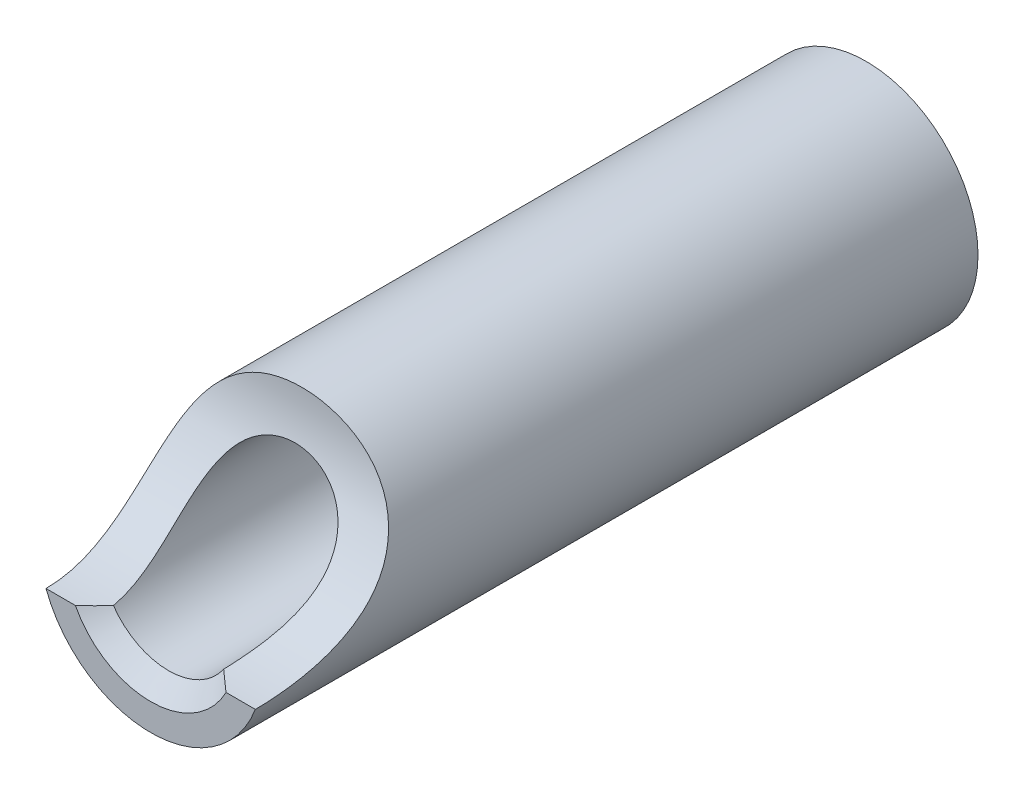
ISO-10303-21;
HEADER;
FILE_DESCRIPTION(('STEP AP214'),'2;1');
FILE_NAME('part.step','',(''),(''),'','','');
FILE_SCHEMA(('AUTOMOTIVE_DESIGN { 1 0 10303 214 1 1 1 1 }'));
ENDSEC;
DATA;
#1=APPLICATION_CONTEXT('core data for automotive mechanical design processes');
#2=APPLICATION_PROTOCOL_DEFINITION('international standard','automotive_design',2000,#1);
#3=PRODUCT_CONTEXT('',#1,'mechanical');
#4=PRODUCT('Part','Part','',(#3));
#5=PRODUCT_RELATED_PRODUCT_CATEGORY('part','',(#4));
#6=PRODUCT_DEFINITION_FORMATION('','',#4);
#7=PRODUCT_DEFINITION_CONTEXT('part definition',#1,'design');
#8=PRODUCT_DEFINITION('design','',#6,#7);
#9=PRODUCT_DEFINITION_SHAPE('','',#8);
#10=(LENGTH_UNIT() NAMED_UNIT(*) SI_UNIT(.MILLI.,.METRE.));
#11=(NAMED_UNIT(*) PLANE_ANGLE_UNIT() SI_UNIT($,.RADIAN.));
#12=(NAMED_UNIT(*) SI_UNIT($,.STERADIAN.) SOLID_ANGLE_UNIT());
#13=UNCERTAINTY_MEASURE_WITH_UNIT(LENGTH_MEASURE(1.E-05),#10,'distance_accuracy_value','');
#14=(GEOMETRIC_REPRESENTATION_CONTEXT(3) GLOBAL_UNCERTAINTY_ASSIGNED_CONTEXT((#13)) GLOBAL_UNIT_ASSIGNED_CONTEXT((#10,
#11,#12)) REPRESENTATION_CONTEXT('',''));
#15=CARTESIAN_POINT('',(0.,0.,0.));
#16=DIRECTION('',(0.,0.,1.));
#17=DIRECTION('',(1.,0.,0.));
#18=AXIS2_PLACEMENT_3D('',#15,#16,#17);
#19=CARTESIAN_POINT('',(0.,0.,50.8));
#20=DIRECTION('',(0.,0.,1.));
#21=DIRECTION('',(1.,0.,0.));
#22=AXIS2_PLACEMENT_3D('',#19,#20,#21);
#23=PLANE('',#22);
#24=DIRECTION('',(1.,0.,0.));
#25=VECTOR('',#24,1.);
#26=CARTESIAN_POINT('',(-7.9375,-2.78989828210711,50.8));
#27=LINE('',#26,#25);
#28=CARTESIAN_POINT('',(-7.43104123427503,-2.78989828210711,50.8));
#29=VERTEX_POINT('',#28);
#30=CARTESIAN_POINT('',(-5.34860017439103,-2.78989828210711,50.8));
#31=VERTEX_POINT('',#30);
#32=EDGE_CURVE('E94',#29,#31,#27,.T.);
#33=ORIENTED_EDGE('',*,*,#32,.F.);
#34=CARTESIAN_POINT('',(0.,0.,50.8));
#35=DIRECTION('',(0.,0.,1.));
#36=DIRECTION('',(1.,0.,0.));
#37=AXIS2_PLACEMENT_3D('',#34,#35,#36);
#38=CIRCLE('',#37,7.9375);
#39=CARTESIAN_POINT('',(7.43104123427503,-2.78989828210711,50.8));
#40=VERTEX_POINT('',#39);
#41=EDGE_CURVE('E95',#29,#40,#38,.T.);
#42=ORIENTED_EDGE('',*,*,#41,.T.);
#43=CARTESIAN_POINT('',(5.34860017439103,-2.78989828210711,50.8));
#44=VERTEX_POINT('',#43);
#45=EDGE_CURVE('E85',#44,#40,#27,.T.);
#46=ORIENTED_EDGE('',*,*,#45,.F.);
#47=CARTESIAN_POINT('',(0.,0.,50.8));
#48=DIRECTION('',(0.,0.,1.));
#49=DIRECTION('',(1.,0.,0.));
#50=AXIS2_PLACEMENT_3D('',#47,#48,#49);
#51=CIRCLE('',#50,6.0325);
#52=EDGE_CURVE('E86',#44,#31,#51,.F.);
#53=ORIENTED_EDGE('',*,*,#52,.T.);
#54=EDGE_LOOP('',(#33,#42,#46,#53));
#55=FACE_BOUND('',#54,.T.);
#56=ADVANCED_FACE('F43',(#55),#23,.T.);
#57=CARTESIAN_POINT('',(0.,0.,0.));
#58=DIRECTION('',(0.,0.,1.));
#59=DIRECTION('',(1.,0.,0.));
#60=AXIS2_PLACEMENT_3D('',#57,#58,#59);
#61=PLANE('',#60);
#62=CARTESIAN_POINT('',(0.,0.,0.));
#63=DIRECTION('',(0.,0.,1.));
#64=DIRECTION('',(1.,0.,0.));
#65=AXIS2_PLACEMENT_3D('',#62,#63,#64);
#66=CIRCLE('',#65,6.03249999999999);
#67=CARTESIAN_POINT('',(6.03249999999999,0.,0.));
#68=VERTEX_POINT('',#67);
#69=EDGE_CURVE('E160',#68,#68,#66,.T.);
#70=ORIENTED_EDGE('',*,*,#69,.T.);
#71=EDGE_LOOP('',(#70));
#72=FACE_BOUND('',#71,.T.);
#73=CARTESIAN_POINT('',(0.,0.,0.));
#74=DIRECTION('',(0.,0.,1.));
#75=DIRECTION('',(1.,0.,0.));
#76=AXIS2_PLACEMENT_3D('',#73,#74,#75);
#77=CIRCLE('',#76,7.9375);
#78=CARTESIAN_POINT('',(7.9375,0.,0.));
#79=VERTEX_POINT('',#78);
#80=EDGE_CURVE('E159',#79,#79,#77,.T.);
#81=ORIENTED_EDGE('',*,*,#80,.F.);
#82=EDGE_LOOP('',(#81));
#83=FACE_BOUND('',#82,.T.);
#84=ADVANCED_FACE('F135',(#72,#83),#61,.F.);
#85=CARTESIAN_POINT('',(0.,0.,50.8));
#86=DIRECTION('',(0.,0.,-1.));
#87=DIRECTION('',(-1.,0.,0.));
#88=AXIS2_PLACEMENT_3D('',#85,#86,#87);
#89=CYLINDRICAL_SURFACE('',#88,7.9375);
#90=ORIENTED_EDGE('',*,*,#41,.F.);
#91=CARTESIAN_POINT('',(-7.43104123427503,-2.78989828210711,50.8));
#92=CARTESIAN_POINT('',(-7.43102382136732,-2.78990287666445,50.6300305804789));
#93=CARTESIAN_POINT('',(-7.43255743304067,-2.78585876748104,50.4600656508634));
#94=CARTESIAN_POINT('',(-7.43859906079418,-2.76970866942878,50.1205840915058));
#95=CARTESIAN_POINT('',(-7.44310686184932,-2.7576032633671,49.9510674302446));
#96=CARTESIAN_POINT('',(-7.45496526672832,-2.72537693640078,49.613010811213));
#97=CARTESIAN_POINT('',(-7.46231395553059,-2.70526141478227,49.4444702729597));
#98=CARTESIAN_POINT('',(-7.47960163144594,-2.65708728652565,49.1086763089797));
#99=CARTESIAN_POINT('',(-7.48954064590534,-2.62902859603045,48.9414228968606));
#100=CARTESIAN_POINT('',(-7.52275189989414,-2.5331339163702,48.4425864015902));
#101=CARTESIAN_POINT('',(-7.54943806174162,-2.45353013550547,48.1134136834843));
#102=CARTESIAN_POINT('',(-7.60848021569662,-2.2637930983823,47.464583373558));
#103=CARTESIAN_POINT('',(-7.64083629896272,-2.15365935125944,47.1449259348169));
#104=CARTESIAN_POINT('',(-7.70233574094531,-1.92102106878398,46.5607278169839));
#105=CARTESIAN_POINT('',(-7.73130869441506,-1.80230290366631,46.2946545453673));
#106=CARTESIAN_POINT('',(-7.78710240029921,-1.54352167511713,45.7728642390489));
#107=CARTESIAN_POINT('',(-7.8139232976753,-1.40346005121877,45.5171465073774));
#108=CARTESIAN_POINT('',(-7.86197518912549,-1.10289819712657,45.0178652563709));
#109=CARTESIAN_POINT('',(-7.88321278062526,-0.942422424901867,44.7742876702836));
#110=CARTESIAN_POINT('',(-7.91650004182506,-0.601824881937868,44.3006127732499));
#111=CARTESIAN_POINT('',(-7.92855177653041,-0.421707537090205,44.0705124433235));
#112=CARTESIAN_POINT('',(-7.93844280788201,-0.084044057264312,43.6736857820491));
#113=CARTESIAN_POINT('',(-7.93879033193087,0.0699700601929678,43.5040087357604));
#114=CARTESIAN_POINT('',(-7.92959105876708,0.388393387492886,43.1750123071314));
#115=CARTESIAN_POINT('',(-7.92004652518047,0.5528002110625,43.0156905640233));
#116=CARTESIAN_POINT('',(-7.88918254279768,0.890772215138729,42.7084726447517));
#117=CARTESIAN_POINT('',(-7.86787031604665,1.06433171944766,42.5605695241686));
#118=CARTESIAN_POINT('',(-7.81166336377182,1.41918364925817,42.2770787619046));
#119=CARTESIAN_POINT('',(-7.7767684837153,1.60047616271895,42.1414912603627));
#120=CARTESIAN_POINT('',(-7.69137320831778,1.97054895184782,41.8823743048738));
#121=CARTESIAN_POINT('',(-7.64073281411452,2.1593825984532,41.7589666599726));
#122=CARTESIAN_POINT('',(-7.52258766260895,2.54054688233775,41.5263918064629));
#123=CARTESIAN_POINT('',(-7.45508285568243,2.73287752990545,41.4172246397589));
#124=CARTESIAN_POINT('',(-7.30232516710918,3.11815088145521,41.2136349154753));
#125=CARTESIAN_POINT('',(-7.2170826963214,3.31109316132285,41.11920376545));
#126=CARTESIAN_POINT('',(-7.0284235603619,3.69470276080392,40.9450465779261));
#127=CARTESIAN_POINT('',(-6.92500944724275,3.88537039586169,40.8653184787273));
#128=CARTESIAN_POINT('',(-6.71620937883633,4.23458896601063,40.7304706130676));
#129=CARTESIAN_POINT('',(-6.61320592477682,4.39384368274212,40.6734630445075));
#130=CARTESIAN_POINT('',(-6.3943568302916,4.7066473026656,40.5693681143987));
#131=CARTESIAN_POINT('',(-6.27851259412107,4.86019682732437,40.5222796697347));
#132=CARTESIAN_POINT('',(-6.03458466691356,5.15994592825254,40.4372517730344));
#133=CARTESIAN_POINT('',(-5.90649959355786,5.30614467156994,40.3993133559901));
#134=CARTESIAN_POINT('',(-5.63889137830772,5.58970647953128,40.3316576211885));
#135=CARTESIAN_POINT('',(-5.49936783446307,5.72706923337377,40.3019405924931));
#136=CARTESIAN_POINT('',(-5.21155080996345,5.9900913555497,40.2500032139038));
#137=CARTESIAN_POINT('',(-5.06338337455723,6.1158718791936,40.2276967834758));
#138=CARTESIAN_POINT('',(-4.7576708045974,6.35659859858504,40.1890294262914));
#139=CARTESIAN_POINT('',(-4.60012174634901,6.47154020848765,40.1726710077992));
#140=CARTESIAN_POINT('',(-4.27669673071728,6.68968005124859,40.1448550946417));
#141=CARTESIAN_POINT('',(-4.11082101241473,6.79287862100354,40.1333974593516));
#142=CARTESIAN_POINT('',(-3.77173904915526,6.98684822231555,40.1143631729308));
#143=CARTESIAN_POINT('',(-3.59853233984044,7.07761846509363,40.1067867680437));
#144=CARTESIAN_POINT('',(-3.23118121890754,7.25314911320936,40.0940615628894));
#145=CARTESIAN_POINT('',(-3.03649126155879,7.33678791981515,40.0891660044906));
#146=CARTESIAN_POINT('',(-2.64100671426011,7.48824637138037,40.0817447095968));
#147=CARTESIAN_POINT('',(-2.44021184398751,7.5560652886854,40.0792190820934));
#148=CARTESIAN_POINT('',(-2.03379159582999,7.67544541188357,40.0756365459336));
#149=CARTESIAN_POINT('',(-1.82816530449564,7.72700351642451,40.0745799173221));
#150=CARTESIAN_POINT('',(-1.41344593813608,7.81351068200985,40.073231036787));
#151=CARTESIAN_POINT('',(-1.20435280924588,7.84845948474122,40.0729387967512));
#152=CARTESIAN_POINT('',(-0.773924495256755,7.90279910859216,40.0726214288197));
#153=CARTESIAN_POINT('',(-0.55248417020049,7.92136086992471,40.0726098230092));
#154=CARTESIAN_POINT('',(-0.108821911205786,7.93985911048411,40.0725980380658));
#155=CARTESIAN_POINT('',(0.113400050017452,7.93979493294639,40.0725978593359));
#156=CARTESIAN_POINT('',(0.557081925983102,7.92103981558556,40.0726102526628));
#157=CARTESIAN_POINT('',(0.778541754002242,7.90234682201283,40.0726228261255));
#158=CARTESIAN_POINT('',(1.21911362131316,7.84646259335156,40.0729517201595));
#159=CARTESIAN_POINT('',(1.43822566935034,7.8092714271926,40.073268039599));
#160=CARTESIAN_POINT('',(1.87366608047325,7.71641694102895,40.0747792047649));
#161=CARTESIAN_POINT('',(2.08997458429771,7.66066051250474,40.0759785163561));
#162=CARTESIAN_POINT('',(2.51711441224049,7.53112529358036,40.0801059368539));
#163=CARTESIAN_POINT('',(2.72794567078238,7.45734628751446,40.0830340664489));
#164=CARTESIAN_POINT('',(3.14263237186589,7.29229568937398,40.0917036258467));
#165=CARTESIAN_POINT('',(3.34648664098042,7.20102117168457,40.097445526421));
#166=CARTESIAN_POINT('',(3.74566174434047,7.00169181846985,40.1130301270691));
#167=CARTESIAN_POINT('',(3.9409826969583,6.89363721580899,40.1228727702384));
#168=CARTESIAN_POINT('',(4.31977867449776,6.66274324086284,40.1479851845992));
#169=CARTESIAN_POINT('',(4.50334850550061,6.54005386370649,40.163202580503));
#170=CARTESIAN_POINT('',(4.85919245243613,6.28018216418937,40.2005851233279));
#171=CARTESIAN_POINT('',(5.03146656754056,6.14299984076593,40.2227502707584));
#172=CARTESIAN_POINT('',(5.36319971911526,5.85560582055087,40.2755468935885));
#173=CARTESIAN_POINT('',(5.5226673083275,5.70540296119538,40.3061726569089));
#174=CARTESIAN_POINT('',(5.82759466033357,5.39356898422031,40.3773780353624));
#175=CARTESIAN_POINT('',(5.97305561285844,5.23193883926645,40.4179568040415));
#176=CARTESIAN_POINT('',(6.23961577527605,4.91037300546002,40.5073070286199));
#177=CARTESIAN_POINT('',(6.3616932561422,4.75104531198242,40.5553501732749));
#178=CARTESIAN_POINT('',(6.59193554411299,4.42605259019641,40.6621474508343));
#179=CARTESIAN_POINT('',(6.70010107495998,4.26038789214064,40.7209010261645));
#180=CARTESIAN_POINT('',(6.90201911734241,3.92483973314183,40.8497281288322));
#181=CARTESIAN_POINT('',(6.99577772128369,3.75495809095937,40.9197968453671));
#182=CARTESIAN_POINT('',(7.16879845948029,3.41305464766019,41.0716165547509));
#183=CARTESIAN_POINT('',(7.24806105230723,3.24103291442775,41.1533671779047));
#184=CARTESIAN_POINT('',(7.38750399675042,2.90843964275421,41.3227583474116));
#185=CARTESIAN_POINT('',(7.44860289189289,2.7478675146072,41.4096455086561));
#186=CARTESIAN_POINT('',(7.5587995738205,2.42837593338201,41.5934487311609));
#187=CARTESIAN_POINT('',(7.60789800040874,2.26945639262911,41.6903642573683));
#188=CARTESIAN_POINT('',(7.6947777365213,1.95472877078506,41.8938979209602));
#189=CARTESIAN_POINT('',(7.73255628093448,1.79892145857967,42.0005184207027));
#190=CARTESIAN_POINT('',(7.7976405784127,1.4917639580717,42.2229651827356));
#191=CARTESIAN_POINT('',(7.82494575352329,1.34041401616661,42.3387919526322));
#192=CARTESIAN_POINT('',(7.87157701811081,1.03338007397375,42.587099485936));
#193=CARTESIAN_POINT('',(7.89025029577197,0.878079143633538,42.7201756793556));
#194=CARTESIAN_POINT('',(7.91811686012925,0.574901539588192,42.9954403401729));
#195=CARTESIAN_POINT('',(7.92730982006122,0.427025121955592,43.1376291214806));
#196=CARTESIAN_POINT('',(7.9375772820049,0.139527823145272,43.4304134417616));
#197=CARTESIAN_POINT('',(7.93865073360163,-9.19875630392625E-05,43.5810100659128));
#198=CARTESIAN_POINT('',(7.93404387610593,-0.270446054395075,43.8899454879953));
#199=CARTESIAN_POINT('',(7.92836121887344,-0.401177204494225,44.0482869593661));
#200=CARTESIAN_POINT('',(7.90989390693172,-0.678613783852588,44.4046577045487));
#201=CARTESIAN_POINT('',(7.89590881020568,-0.823229149697682,44.604254457878));
#202=CARTESIAN_POINT('',(7.86238293051072,-1.09819386979365,45.0126064154519));
#203=CARTESIAN_POINT('',(7.84284134346322,-1.22854115552983,45.2213629415051));
#204=CARTESIAN_POINT('',(7.8003209128347,-1.47462359322823,45.6473701113936));
#205=CARTESIAN_POINT('',(7.77733726839133,-1.59033791313799,45.8646323009673));
#206=CARTESIAN_POINT('',(7.72999114882314,-1.806482712425,46.3064109493798));
#207=CARTESIAN_POINT('',(7.70562897561742,-1.90691652083172,46.5309258151837));
#208=CARTESIAN_POINT('',(7.65259776899222,-2.11065345708935,47.0318880602186));
#209=CARTESIAN_POINT('',(7.62404034515744,-2.21052342782973,47.3097518270733));
#210=CARTESIAN_POINT('',(7.57060495110342,-2.3871258983928,47.8731674362436));
#211=CARTESIAN_POINT('',(7.54572795089281,-2.4638523040371,48.1587212819916));
#212=CARTESIAN_POINT('',(7.50218788803438,-2.59340524256803,48.7350179942113));
#213=CARTESIAN_POINT('',(7.48351150518844,-2.64628309585342,49.0257483052244));
#214=CARTESIAN_POINT('',(7.45416238914075,-2.72787019902771,49.6108448758105));
#215=CARTESIAN_POINT('',(7.44348413111675,-2.75659613389263,49.905208482496));
#216=CARTESIAN_POINT('',(7.43523171009228,-2.77871385296336,50.3001386623243));
#217=CARTESIAN_POINT('',(7.43366173602437,-2.78290939706428,50.4001067663649));
#218=CARTESIAN_POINT('',(7.43156687133923,-2.78850006953762,50.6000460665885));
#219=CARTESIAN_POINT('',(7.43104108242416,-2.78989760500609,50.7000171860604));
#220=CARTESIAN_POINT('',(7.43104123427503,-2.78989828210711,50.8));
#221=B_SPLINE_CURVE_WITH_KNOTS('',3,(#91,#92,#93,#94,#95,#96,#97,#98,#99,#100,#101,#102,#103,
#104,#105,#106,#107,#108,#109,#110,#111,#112,#113,#114,#115,#116,#117,#118,#119,#120,#121,#122,
#123,#124,#125,#126,#127,#128,#129,#130,#131,#132,#133,#134,#135,#136,#137,#138,#139,#140,#141,
#142,#143,#144,#145,#146,#147,#148,#149,#150,#151,#152,#153,#154,#155,#156,#157,#158,#159,#160,
#161,#162,#163,#164,#165,#166,#167,#168,#169,#170,#171,#172,#173,#174,#175,#176,#177,#178,#179,
#180,#181,#182,#183,#184,#185,#186,#187,#188,#189,#190,#191,#192,#193,#194,#195,#196,#197,#198,
#199,#200,#201,#202,#203,#204,#205,#206,#207,#208,#209,#210,#211,#212,#213,#214,#215,#216,#217,
#218,#219,#220),.UNSPECIFIED.,.F.,.F.,(4,2,2,2,2,2,2,2,2,2,2,2,2,2,2,2,2,2,2,2,2,2,2,2,2,2,2,2,
2,2,2,2,2,2,2,2,2,2,2,2,2,2,2,2,2,2,2,2,2,2,2,2,2,2,2,2,2,2,2,2,2,2,2,2,4),(0.,
0.509845414138052,1.01965397201026,1.52911946923528,2.03859034515617,3.0559905843102,
4.07340718229475,4.95085338894839,5.82824044144487,6.704586035469,7.58073456649302,
8.26757405911852,8.95425641511876,9.64051780945825,10.326787011767,11.019341532883,
11.7118980918923,12.4040493058887,13.096103390715,13.6895054213489,14.2828426220308,
14.8762469057443,15.4696720507527,16.0559411240219,16.6424571397929,17.228956324734,
17.8154927153267,18.4506410759057,19.0858186451223,19.7211172857626,20.3564258064415,
21.0222880656987,21.6881738037617,22.3541329610849,23.0200896368693,23.6894378286186,
24.3587940304621,25.0282622604399,25.6977212007498,26.3608287151634,27.0239362781984,
27.6865972419552,28.3492018691991,28.9675460875384,29.5858581246908,30.2039079659695,
30.8219382522709,31.3988627585566,31.9757564994896,32.5527910437724,33.1298574261124,
33.7453708834771,34.3609055554281,34.9765198572967,35.5923481834397,36.3322810443941,
37.0723210354248,37.8134029908712,38.5543232614619,39.4432222363125,40.3323550726886,
41.2195653204806,42.1061621481226,42.4063344655777,42.7062484369379),.UNSPECIFIED.);
#222=EDGE_CURVE('E72',#29,#40,#221,.T.);
#223=ORIENTED_EDGE('',*,*,#222,.T.);
#224=EDGE_LOOP('',(#90,#223));
#225=FACE_BOUND('',#224,.T.);
#226=ORIENTED_EDGE('',*,*,#80,.T.);
#227=EDGE_LOOP('',(#226));
#228=FACE_BOUND('',#227,.T.);
#229=ADVANCED_FACE('F126',(#225,#228),#89,.T.);
#230=CARTESIAN_POINT('',(0.,0.,50.8));
#231=DIRECTION('',(0.,0.,-1.));
#232=DIRECTION('',(-1.,0.,0.));
#233=AXIS2_PLACEMENT_3D('',#230,#231,#232);
#234=CYLINDRICAL_SURFACE('',#233,4.7625);
#235=CARTESIAN_POINT('',(-3.91319984407248,-2.71445634158133,49.53));
#236=CARTESIAN_POINT('',(-3.92477474195459,-2.69775519508808,49.3899162085328));
#237=CARTESIAN_POINT('',(-3.93811611844276,-2.67830965194911,49.2503326703605));
#238=CARTESIAN_POINT('',(-3.96789072660615,-2.63400441673134,48.972387630169));
#239=CARTESIAN_POINT('',(-3.98432332276705,-2.60914583733676,48.8340258830759));
#240=CARTESIAN_POINT('',(-4.03756313443191,-2.52661522842537,48.4213432830804));
#241=CARTESIAN_POINT('',(-4.07834166340507,-2.46094870362557,48.1490947210658));
#242=CARTESIAN_POINT('',(-4.16675323114825,-2.30812202232267,47.6087610603299));
#243=CARTESIAN_POINT('',(-4.21445364003718,-2.22074377921141,47.3407495182108));
#244=CARTESIAN_POINT('',(-4.31178303705702,-2.02530298558978,46.8126557766273));
#245=CARTESIAN_POINT('',(-4.36141255450945,-1.91723472562796,46.5525757889109));
#246=CARTESIAN_POINT('',(-4.45953684002279,-1.67671799519169,46.0325327264907));
#247=CARTESIAN_POINT('',(-4.50793483451605,-1.5435624358726,45.772877519965));
#248=CARTESIAN_POINT('',(-4.59641924167773,-1.25578782333059,45.2641239475283));
#249=CARTESIAN_POINT('',(-4.63650408449052,-1.10116472536433,45.0150275826022));
#250=CARTESIAN_POINT('',(-4.7024895504514,-0.772020724570098,44.530503870173));
#251=CARTESIAN_POINT('',(-4.7284744536202,-0.597625756111042,44.2950029950161));
#252=CARTESIAN_POINT('',(-4.76055398171783,-0.229395675322941,43.8383427760397));
#253=CARTESIAN_POINT('',(-4.76666791149317,-0.0355796196375981,43.617169717516));
#254=CARTESIAN_POINT('',(-4.75568641732243,0.277890105398365,43.2877745253676));
#255=CARTESIAN_POINT('',(-4.74780461695139,0.391626668609118,43.1735484637219));
#256=CARTESIAN_POINT('',(-4.7229374401565,0.623592466895284,42.95081880947));
#257=CARTESIAN_POINT('',(-4.70595520818974,0.741820137063701,42.842313254482));
#258=CARTESIAN_POINT('',(-4.66176323997821,0.981976856696082,42.6315666575633));
#259=CARTESIAN_POINT('',(-4.63455069667544,1.10390691359609,42.5293273439667));
#260=CARTESIAN_POINT('',(-4.56883652988234,1.3503319825667,42.3317519320097));
#261=CARTESIAN_POINT('',(-4.5303345628083,1.4748270725946,42.2364160438592));
#262=CARTESIAN_POINT('',(-4.44064152800393,1.72630004516187,42.0522800095183));
#263=CARTESIAN_POINT('',(-4.38932133317566,1.85329026991172,41.9635590974261));
#264=CARTESIAN_POINT('',(-4.27346248017366,2.10673518511485,41.7943088213265));
#265=CARTESIAN_POINT('',(-4.20892365357021,2.2331898687234,41.7137795617154));
#266=CARTESIAN_POINT('',(-4.06626123484679,2.48347633544905,41.5613771232087));
#267=CARTESIAN_POINT('',(-3.98814900167767,2.60731021535468,41.4894967908847));
#268=CARTESIAN_POINT('',(-3.81826028399642,2.85030822784817,41.3545319701076));
#269=CARTESIAN_POINT('',(-3.72648632218529,2.96947321744722,41.2914458619166));
#270=CARTESIAN_POINT('',(-3.54380919040815,3.18429808588268,41.1824894568519));
#271=CARTESIAN_POINT('',(-3.4546766377466,3.28087465679276,41.1354479796949));
#272=CARTESIAN_POINT('',(-3.26713795633864,3.46766841297736,41.0476501170323));
#273=CARTESIAN_POINT('',(-3.16873272178008,3.55788620998068,41.0068931264952));
#274=CARTESIAN_POINT('',(-2.96332225570445,3.73070259394992,40.93142234796));
#275=CARTESIAN_POINT('',(-2.85631836304389,3.8133023627981,40.8967076218042));
#276=CARTESIAN_POINT('',(-2.63451794640045,3.96977810852889,40.8329845306473));
#277=CARTESIAN_POINT('',(-2.51972175212318,4.04365445415255,40.8039759244127));
#278=CARTESIAN_POINT('',(-2.29371336655106,4.17562846786185,40.7536107076613));
#279=CARTESIAN_POINT('',(-2.18307653917938,4.23454285651943,40.731805092822));
#280=CARTESIAN_POINT('',(-1.95685809936797,4.34371840023418,40.6923207172322));
#281=CARTESIAN_POINT('',(-1.84127492879149,4.39397680316244,40.6746432683789));
#282=CARTESIAN_POINT('',(-1.60608546971214,4.48528731532908,40.6431483919929));
#283=CARTESIAN_POINT('',(-1.48648113829372,4.52634383058556,40.6293291163201));
#284=CARTESIAN_POINT('',(-1.24400728188263,4.59889906972001,40.6052817464593));
#285=CARTESIAN_POINT('',(-1.1211365590192,4.63039423311215,40.5950549898423));
#286=CARTESIAN_POINT('',(-0.873366670874833,4.6834439643601,40.5780154461313));
#287=CARTESIAN_POINT('',(-0.748473502941439,4.70502377111882,40.5711939871962));
#288=CARTESIAN_POINT('',(-0.497186197713734,4.738172558113,40.5607773545571));
#289=CARTESIAN_POINT('',(-0.370791526925702,4.74973786531246,40.5571833645798));
#290=CARTESIAN_POINT('',(-0.11747121836675,4.7627394404709,40.553146051617));
#291=CARTESIAN_POINT('',(0.00945424492675905,4.76417880960195,40.5527017640025));
#292=CARTESIAN_POINT('',(0.263034210030704,4.75692275713666,40.5549516082186));
#293=CARTESIAN_POINT('',(0.389688594166705,4.74822358428764,40.5576469016915));
#294=CARTESIAN_POINT('',(0.64270578135575,4.72066165579764,40.5662697495959));
#295=CARTESIAN_POINT('',(0.76905983539328,4.70172577629517,40.5722205628881));
#296=CARTESIAN_POINT('',(1.01968978402765,4.65380733524417,40.5875043141291));
#297=CARTESIAN_POINT('',(1.14396488858501,4.62482104135771,40.5968385085944));
#298=CARTESIAN_POINT('',(1.38944469596862,4.55708839408115,40.6190786232835));
#299=CARTESIAN_POINT('',(1.51065063821459,4.51834605195284,40.6319830757875));
#300=CARTESIAN_POINT('',(1.74921213992428,4.43145392734487,40.6616164483462));
#301=CARTESIAN_POINT('',(1.86656627797814,4.38330071661459,40.6783467624888));
#302=CARTESIAN_POINT('',(2.09607498661402,4.27828686634574,40.715837812748));
#303=CARTESIAN_POINT('',(2.20824814603751,4.22146112077661,40.7365824829488));
#304=CARTESIAN_POINT('',(2.42708311212328,4.09955619245618,40.7824404196852));
#305=CARTESIAN_POINT('',(2.53374488012158,4.03447695181531,40.8075537168624));
#306=CARTESIAN_POINT('',(2.74078936855524,3.89678483057353,40.8624357777758));
#307=CARTESIAN_POINT('',(2.84117349912627,3.82417365167373,40.892203490701));
#308=CARTESIAN_POINT('',(3.03502610801124,3.67221902595228,40.9566640113774));
#309=CARTESIAN_POINT('',(3.12849448142468,3.59287547705096,40.9913568938119));
#310=CARTESIAN_POINT('',(3.30725124884191,3.42900482162599,41.0655991296977));
#311=CARTESIAN_POINT('',(3.3925980666363,3.34452326732398,41.1051082455574));
#312=CARTESIAN_POINT('',(3.55552291042352,3.17078485337193,41.1893365031945));
#313=CARTESIAN_POINT('',(3.63309831507107,3.0815263979153,41.2340573920046));
#314=CARTESIAN_POINT('',(3.8536102940412,2.80815396426213,41.3761558303912));
#315=CARTESIAN_POINT('',(3.98450983888547,2.61827787413094,41.4815416990904));
#316=CARTESIAN_POINT('',(4.21677141561063,2.22575636957439,41.7166610734099));
#317=CARTESIAN_POINT('',(4.31709677854445,2.02289770693877,41.8470458118535));
#318=CARTESIAN_POINT('',(4.48469517504473,1.61771810108968,42.1283084033941));
#319=CARTESIAN_POINT('',(4.55195275573634,1.41539745313494,42.2791957956097));
#320=CARTESIAN_POINT('',(4.64201541831934,1.07457990184289,42.5531372253435));
#321=CARTESIAN_POINT('',(4.67203120250179,0.934367085624284,42.6718223982537));
#322=CARTESIAN_POINT('',(4.71875416701341,0.658986341459365,42.9174666007618));
#323=CARTESIAN_POINT('',(4.73545665049312,0.523820209967337,43.0444285332755));
#324=CARTESIAN_POINT('',(4.75727002069524,0.259611617737427,43.3058873428067));
#325=CARTESIAN_POINT('',(4.7623616443306,0.130579680656124,43.4403963627131));
#326=CARTESIAN_POINT('',(4.76263282626502,-0.120316179798814,43.7159741959945));
#327=CARTESIAN_POINT('',(4.75780937183347,-0.242177912908211,43.8570449904574));
#328=CARTESIAN_POINT('',(4.73601834101968,-0.5295218837044,44.2077332116234));
#329=CARTESIAN_POINT('',(4.71467791256945,-0.690897144110019,44.4204546637501));
#330=CARTESIAN_POINT('',(4.6596304006388,-0.996695421558549,44.856248778224));
#331=CARTESIAN_POINT('',(4.62591761128367,-1.14111057632705,45.0793261749878));
#332=CARTESIAN_POINT('',(4.55034114239115,-1.41269057443243,45.534883732701));
#333=CARTESIAN_POINT('',(4.50846420074745,-1.53982677119858,45.7673786983629));
#334=CARTESIAN_POINT('',(4.42064723123003,-1.7762845120362,46.2404607877242));
#335=CARTESIAN_POINT('',(4.37470765133628,-1.88560801651246,46.4810470174057));
#336=CARTESIAN_POINT('',(4.28659669130918,-2.07766343611547,46.9487762287869));
#337=CARTESIAN_POINT('',(4.24443767394364,-2.1618672456609,47.1753185835593));
#338=CARTESIAN_POINT('',(4.16294802691743,-2.31490510515341,47.6339776387677));
#339=CARTESIAN_POINT('',(4.12361667656306,-2.38374308090624,47.8660928985626));
#340=CARTESIAN_POINT('',(4.05077716097327,-2.50552172713468,48.3344993988888));
#341=CARTESIAN_POINT('',(4.01724869177881,-2.55851831941672,48.5707727555543));
#342=CARTESIAN_POINT('',(3.97316256172253,-2.62604357491946,48.92827532529));
#343=CARTESIAN_POINT('',(3.95949654250705,-2.64656403201286,49.0480165391697));
#344=CARTESIAN_POINT('',(3.93451537156721,-2.68355800224717,49.2883819035924));
#345=CARTESIAN_POINT('',(3.92320053684175,-2.70003096973907,49.4090061709266));
#346=CARTESIAN_POINT('',(3.91319984407248,-2.71445634158133,49.53));
#347=B_SPLINE_CURVE_WITH_KNOTS('',3,(#235,#236,#237,#238,#239,#240,#241,#242,#243,#244,#245,
#246,#247,#248,#249,#250,#251,#252,#253,#254,#255,#256,#257,#258,#259,#260,#261,#262,#263,#264,
#265,#266,#267,#268,#269,#270,#271,#272,#273,#274,#275,#276,#277,#278,#279,#280,#281,#282,#283,
#284,#285,#286,#287,#288,#289,#290,#291,#292,#293,#294,#295,#296,#297,#298,#299,#300,#301,#302,
#303,#304,#305,#306,#307,#308,#309,#310,#311,#312,#313,#314,#315,#316,#317,#318,#319,#320,#321,
#322,#323,#324,#325,#326,#327,#328,#329,#330,#331,#332,#333,#334,#335,#336,#337,#338,#339,#340,
#341,#342,#343,#344,#345,#346),.UNSPECIFIED.,.F.,.F.,(4,2,2,2,2,2,2,2,2,2,2,2,2,2,2,2,2,2,2,2,2,
2,2,2,2,2,2,2,2,2,2,2,2,2,2,2,2,2,2,2,2,2,2,2,2,2,2,2,2,2,2,2,2,2,2,4),(0.,0.424564240304045,
0.84904129095722,1.69699690724355,2.5538410174625,3.41092191722119,4.29729917446163,
5.18384366308397,6.06502891299414,6.94535782644979,7.42916653420801,7.91280818003029,
8.39658262750021,8.88037179974985,9.36924631217379,9.85812705414771,10.3466006277884,
10.834984114168,11.2531745203227,11.6713246405226,12.0894097782272,12.5074772370481,
12.8887101571552,13.2700640655615,13.6512349833619,14.0325476691495,14.412884296423,
14.7933603614298,15.1737198966764,15.554220209347,15.9374751741474,16.3208726178312,
16.7041126818456,17.087492616075,17.4693688187082,17.8512476999489,18.2330404899209,
18.614839069867,18.9936421969986,19.372572669547,20.1296844920413,20.9101704555291,
21.6910208013473,22.2487187200209,22.8066133040664,23.3654327961455,23.9244221125508,
24.7267741880021,25.5294967574407,26.333534326327,27.1374833456938,27.8729485566513,
28.6082256485148,29.3408756171444,29.7075530762774,30.0742799407378),.UNSPECIFIED.);
#348=CARTESIAN_POINT('',(-3.91319984407248,-2.71445634158133,49.53));
#349=VERTEX_POINT('',#348);
#350=CARTESIAN_POINT('',(3.91319984407248,-2.71445634158133,49.53));
#351=VERTEX_POINT('',#350);
#352=EDGE_CURVE('E63',#349,#351,#347,.T.);
#353=ORIENTED_EDGE('',*,*,#352,.F.);
#354=CARTESIAN_POINT('',(0.,0.,49.53));
#355=DIRECTION('',(0.,0.,1.));
#356=DIRECTION('',(1.,0.,0.));
#357=AXIS2_PLACEMENT_3D('',#354,#355,#356);
#358=CIRCLE('',#357,4.7625);
#359=EDGE_CURVE('E97',#349,#351,#358,.T.);
#360=ORIENTED_EDGE('',*,*,#359,.T.);
#361=EDGE_LOOP('',(#353,#360));
#362=FACE_BOUND('',#361,.T.);
#363=CARTESIAN_POINT('',(0.,0.,1.26999999999999));
#364=DIRECTION('',(0.,0.,1.));
#365=DIRECTION('',(1.,0.,0.));
#366=AXIS2_PLACEMENT_3D('',#363,#364,#365);
#367=CIRCLE('',#366,4.7625);
#368=CARTESIAN_POINT('',(4.7625,0.,1.26999999999999));
#369=VERTEX_POINT('',#368);
#370=EDGE_CURVE('E96',#369,#369,#367,.F.);
#371=ORIENTED_EDGE('',*,*,#370,.T.);
#372=EDGE_LOOP('',(#371));
#373=FACE_BOUND('',#372,.T.);
#374=ADVANCED_FACE('F108',(#362,#373),#234,.F.);
#375=CARTESIAN_POINT('',(0.,0.,0.));
#376=DIRECTION('',(0.,0.,-1.));
#377=DIRECTION('',(-1.,0.,0.));
#378=AXIS2_PLACEMENT_3D('',#375,#376,#377);
#379=CONICAL_SURFACE('',#378,6.03249999999999,0.785398163397447);
#380=ORIENTED_EDGE('',*,*,#370,.F.);
#381=EDGE_LOOP('',(#380));
#382=FACE_BOUND('',#381,.T.);
#383=ORIENTED_EDGE('',*,*,#69,.F.);
#384=EDGE_LOOP('',(#383));
#385=FACE_BOUND('',#384,.T.);
#386=ADVANCED_FACE('F134',(#382,#385),#379,.F.);
#387=CARTESIAN_POINT('',(0.,0.,49.53));
#388=DIRECTION('',(0.,0.,1.));
#389=DIRECTION('',(1.,0.,0.));
#390=AXIS2_PLACEMENT_3D('',#387,#388,#389);
#391=CONICAL_SURFACE('',#390,4.7625,0.785398163397449);
#392=CARTESIAN_POINT('',(-7.30371110838529,-2.64840765672247,52.5365577981453));
#393=CARTESIAN_POINT('',(-7.15346781026625,-2.67034823006727,52.4027949804522));
#394=CARTESIAN_POINT('',(-7.00297241585412,-2.68971051449162,52.2689085101564));
#395=CARTESIAN_POINT('',(-6.70158499815848,-2.72331899958649,52.0009407403094));
#396=CARTESIAN_POINT('',(-6.55069297625054,-2.7375652179768,51.8668594414347));
#397=CARTESIAN_POINT('',(-6.09755248795734,-2.77269298415354,51.4643746334893));
#398=CARTESIAN_POINT('',(-5.79486874805465,-2.78595940788114,51.1957561479618));
#399=CARTESIAN_POINT('',(-5.20480182232298,-2.79216501333083,50.6724580353146));
#400=CARTESIAN_POINT('',(-4.9174324790995,-2.78611470008987,50.4177721600079));
#401=CARTESIAN_POINT('',(-4.34294780666886,-2.75588560023192,49.9092809537352));
#402=CARTESIAN_POINT('',(-4.05583243432676,-2.73171097063812,49.6554754342579));
#403=CARTESIAN_POINT('',(-3.66499296593018,-2.68651224064604,49.311395108337));
#404=CARTESIAN_POINT('',(-3.56117990885873,-2.67332521511783,49.2201381016413));
#405=CARTESIAN_POINT('',(-3.35112619706305,-2.64427618437237,49.0359202287486));
#406=CARTESIAN_POINT('',(-3.2448848458967,-2.62835943660925,48.9429686835392));
#407=CARTESIAN_POINT('',(-3.03229214870648,-2.59410498460294,48.7576351304184));
#408=CARTESIAN_POINT('',(-2.92594080000817,-2.57576722005471,48.6652531367538));
#409=CARTESIAN_POINT('',(-2.71295720468598,-2.53671653985694,48.4812290369184));
#410=CARTESIAN_POINT('',(-2.6063248622443,-2.51600267134967,48.3895872434601));
#411=CARTESIAN_POINT('',(-2.39255421823253,-2.47232790964599,48.2074403721786));
#412=CARTESIAN_POINT('',(-2.28541592498358,-2.44936705328313,48.1169352757495));
#413=CARTESIAN_POINT('',(-2.17788905716944,-2.42534344858579,48.0271766080298));
#414=B_SPLINE_CURVE_WITH_KNOTS('',3,(#392,#393,#394,#395,#396,#397,#398,#399,#400,#401,#402,
#403,#404,#405,#406,#407,#408,#409,#410,#411,#412,#413),.UNSPECIFIED.,.F.,.F.,(4,2,2,2,2,2,2,2,
2,2,4),(0.,0.607023293699481,1.2140444849191,2.4282044698089,3.5799096247298,4.73135070343219,
5.14788247813461,5.57403356478702,6.00019526842805,6.42652847150632,6.85285468712682),.UNSPECIFIED.);
#415=EDGE_CURVE('E11',#31,#349,#414,.T.);
#416=ORIENTED_EDGE('',*,*,#415,.F.);
#417=ORIENTED_EDGE('',*,*,#52,.F.);
#418=CARTESIAN_POINT('',(2.17788905716944,-2.42534344858579,48.0271766080298));
#419=CARTESIAN_POINT('',(2.28541592498362,-2.44936705328312,48.1169352757495));
#420=CARTESIAN_POINT('',(2.39255421823256,-2.47232790964599,48.2074403721785));
#421=CARTESIAN_POINT('',(2.60632486224429,-2.51600267134967,48.3895872434601));
#422=CARTESIAN_POINT('',(2.71295720468594,-2.53671653985694,48.4812290369184));
#423=CARTESIAN_POINT('',(2.92594080000821,-2.5757672200547,48.6652531367538));
#424=CARTESIAN_POINT('',(3.03229214870662,-2.59410498460292,48.7576351304182));
#425=CARTESIAN_POINT('',(3.24488484589657,-2.62835943660928,48.9429686835394));
#426=CARTESIAN_POINT('',(3.35112619706256,-2.64427618437246,49.0359202287491));
#427=CARTESIAN_POINT('',(3.56117990885822,-2.67332521511792,49.2201381016419));
#428=CARTESIAN_POINT('',(3.66499296592999,-2.68651224064608,49.3113951083372));
#429=CARTESIAN_POINT('',(4.05583243432733,-2.73171097063802,49.6554754342573));
#430=CARTESIAN_POINT('',(4.34294780666902,-2.75588560023189,49.9092809537351));
#431=CARTESIAN_POINT('',(4.91743247909936,-2.7861147000899,50.4177721600081));
#432=CARTESIAN_POINT('',(5.20480182232294,-2.79216501333084,50.6724580353146));
#433=CARTESIAN_POINT('',(5.79486874805468,-2.78595940788113,51.1957561479617));
#434=CARTESIAN_POINT('',(6.09755248795734,-2.77269298415354,51.4643746334893));
#435=CARTESIAN_POINT('',(6.55069297625052,-2.7375652179768,51.8668594414347));
#436=CARTESIAN_POINT('',(6.70158499815847,-2.72331899958649,52.0009407403094));
#437=CARTESIAN_POINT('',(7.00297241585411,-2.68971051449162,52.2689085101564));
#438=CARTESIAN_POINT('',(7.15346781026625,-2.67034823006727,52.4027949804522));
#439=CARTESIAN_POINT('',(7.30371110838529,-2.64840765672247,52.5365577981453));
#440=B_SPLINE_CURVE_WITH_KNOTS('',3,(#418,#419,#420,#421,#422,#423,#424,#425,#426,#427,#428,
#429,#430,#431,#432,#433,#434,#435,#436,#437,#438,#439),.UNSPECIFIED.,.F.,.F.,(4,2,2,2,2,2,2,2,
2,2,4),(0.,0.426326215620513,0.852659418698774,1.27882112233981,1.70497220899222,
2.12150398369465,3.27294506239704,4.42465021731792,5.6388102022077,6.24583139342733,
6.85285468712682),.UNSPECIFIED.);
#441=EDGE_CURVE('E59',#351,#44,#440,.T.);
#442=ORIENTED_EDGE('',*,*,#441,.F.);
#443=ORIENTED_EDGE('',*,*,#359,.F.);
#444=EDGE_LOOP('',(#416,#417,#442,#443));
#445=FACE_BOUND('',#444,.T.);
#446=ADVANCED_FACE('F46',(#445),#391,.F.);
#447=CARTESIAN_POINT('',(-7.9375,7.9375,50.8));
#448=DIRECTION('',(1.,0.,0.));
#449=DIRECTION('',(0.,0.,-1.));
#450=AXIS2_PLACEMENT_3D('',#447,#448,#449);
#451=CYLINDRICAL_SURFACE('',#450,10.7273982821071);
#452=ORIENTED_EDGE('',*,*,#32,.T.);
#453=ORIENTED_EDGE('',*,*,#415,.T.);
#454=ORIENTED_EDGE('',*,*,#352,.T.);
#455=ORIENTED_EDGE('',*,*,#441,.T.);
#456=ORIENTED_EDGE('',*,*,#45,.T.);
#457=ORIENTED_EDGE('',*,*,#222,.F.);
#458=EDGE_LOOP('',(#452,#453,#454,#455,#456,#457));
#459=FACE_BOUND('',#458,.T.);
#460=ADVANCED_FACE('F82',(#459),#451,.F.);
#461=CLOSED_SHELL('',(#56,#84,#229,#374,#386,#446,#460));
#462=MANIFOLD_SOLID_BREP('B2',#461);
#463=ADVANCED_BREP_SHAPE_REPRESENTATION('',(#18,#462),#14);
#464=SHAPE_DEFINITION_REPRESENTATION(#9,#463);
ENDSEC;
END-ISO-10303-21;
